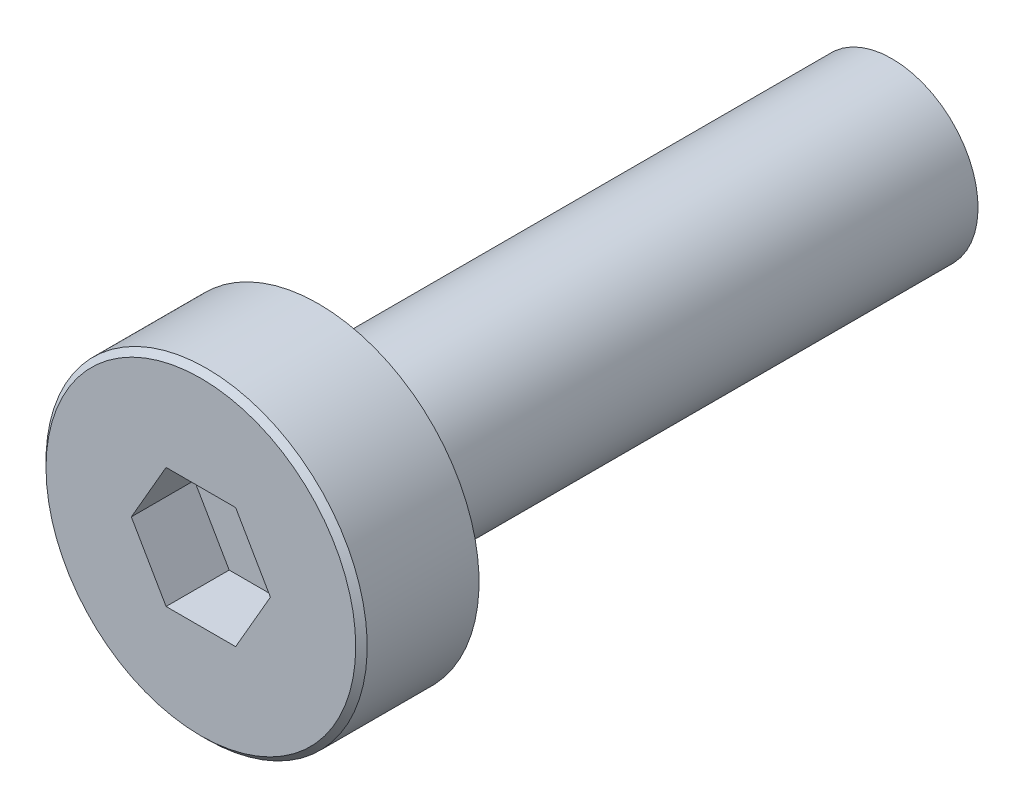
ISO-10303-21;
HEADER;
FILE_DESCRIPTION(('STEP AP214'),'2;1');
FILE_NAME('part.step','',(''),(''),'','','');
FILE_SCHEMA(('AUTOMOTIVE_DESIGN { 1 0 10303 214 1 1 1 1 }'));
ENDSEC;
DATA;
#1=APPLICATION_CONTEXT('core data for automotive mechanical design processes');
#2=APPLICATION_PROTOCOL_DEFINITION('international standard','automotive_design',2000,#1);
#3=PRODUCT_CONTEXT('',#1,'mechanical');
#4=PRODUCT('Part','Part','',(#3));
#5=PRODUCT_RELATED_PRODUCT_CATEGORY('part','',(#4));
#6=PRODUCT_DEFINITION_FORMATION('','',#4);
#7=PRODUCT_DEFINITION_CONTEXT('part definition',#1,'design');
#8=PRODUCT_DEFINITION('design','',#6,#7);
#9=PRODUCT_DEFINITION_SHAPE('','',#8);
#10=(LENGTH_UNIT() NAMED_UNIT(*) SI_UNIT(.MILLI.,.METRE.));
#11=(NAMED_UNIT(*) PLANE_ANGLE_UNIT() SI_UNIT($,.RADIAN.));
#12=(NAMED_UNIT(*) SI_UNIT($,.STERADIAN.) SOLID_ANGLE_UNIT());
#13=UNCERTAINTY_MEASURE_WITH_UNIT(LENGTH_MEASURE(1.E-05),#10,'distance_accuracy_value','');
#14=(GEOMETRIC_REPRESENTATION_CONTEXT(3) GLOBAL_UNCERTAINTY_ASSIGNED_CONTEXT((#13)) GLOBAL_UNIT_ASSIGNED_CONTEXT((#10,
#11,#12)) REPRESENTATION_CONTEXT('',''));
#15=CARTESIAN_POINT('',(0.,0.,0.));
#16=DIRECTION('',(0.,0.,1.));
#17=DIRECTION('',(1.,0.,0.));
#18=AXIS2_PLACEMENT_3D('',#15,#16,#17);
#19=CARTESIAN_POINT('',(0.,0.,0.));
#20=DIRECTION('',(0.,0.,1.));
#21=DIRECTION('',(0.,-1.,0.));
#22=AXIS2_PLACEMENT_3D('',#19,#20,#21);
#23=PLANE('',#22);
#24=CARTESIAN_POINT('',(0.,0.,0.));
#25=DIRECTION('',(0.,0.,1.));
#26=DIRECTION('',(0.,-1.,0.));
#27=AXIS2_PLACEMENT_3D('',#24,#25,#26);
#28=CIRCLE('',#27,2.7);
#29=CARTESIAN_POINT('',(0.,-2.7,0.));
#30=VERTEX_POINT('',#29);
#31=EDGE_CURVE('E11',#30,#30,#28,.T.);
#32=ORIENTED_EDGE('',*,*,#31,.T.);
#33=EDGE_LOOP('',(#32));
#34=FACE_BOUND('',#33,.T.);
#35=DIRECTION('',(-0.5,0.866025403784439,0.));
#36=VECTOR('',#35,1.);
#37=CARTESIAN_POINT('',(1.21243556529821,0.,0.));
#38=LINE('',#37,#36);
#39=CARTESIAN_POINT('',(1.21243556529821,0.,0.));
#40=VERTEX_POINT('',#39);
#41=CARTESIAN_POINT('',(0.606217782649107,1.05,0.));
#42=VERTEX_POINT('',#41);
#43=EDGE_CURVE('E56',#40,#42,#38,.T.);
#44=ORIENTED_EDGE('',*,*,#43,.F.);
#45=DIRECTION('',(0.5,0.866025403784439,0.));
#46=VECTOR('',#45,1.);
#47=CARTESIAN_POINT('',(0.606217782649107,-1.05,0.));
#48=LINE('',#47,#46);
#49=CARTESIAN_POINT('',(0.606217782649107,-1.05,0.));
#50=VERTEX_POINT('',#49);
#51=EDGE_CURVE('E139',#50,#40,#48,.T.);
#52=ORIENTED_EDGE('',*,*,#51,.F.);
#53=DIRECTION('',(1.,0.,0.));
#54=VECTOR('',#53,1.);
#55=CARTESIAN_POINT('',(-0.606217782649107,-1.05,0.));
#56=LINE('',#55,#54);
#57=CARTESIAN_POINT('',(-0.606217782649107,-1.05,0.));
#58=VERTEX_POINT('',#57);
#59=EDGE_CURVE('E137',#58,#50,#56,.T.);
#60=ORIENTED_EDGE('',*,*,#59,.F.);
#61=DIRECTION('',(0.5,-0.866025403784438,0.));
#62=VECTOR('',#61,1.);
#63=CARTESIAN_POINT('',(-1.21243556529821,0.,0.));
#64=LINE('',#63,#62);
#65=CARTESIAN_POINT('',(-1.21243556529821,0.,0.));
#66=VERTEX_POINT('',#65);
#67=EDGE_CURVE('E104',#66,#58,#64,.T.);
#68=ORIENTED_EDGE('',*,*,#67,.F.);
#69=DIRECTION('',(-0.5,-0.866025403784439,0.));
#70=VECTOR('',#69,1.);
#71=CARTESIAN_POINT('',(-0.606217782649107,1.05,0.));
#72=LINE('',#71,#70);
#73=CARTESIAN_POINT('',(-0.606217782649107,1.05,0.));
#74=VERTEX_POINT('',#73);
#75=EDGE_CURVE('E133',#74,#66,#72,.T.);
#76=ORIENTED_EDGE('',*,*,#75,.F.);
#77=DIRECTION('',(-1.,0.,0.));
#78=VECTOR('',#77,1.);
#79=CARTESIAN_POINT('',(0.606217782649107,1.05,0.));
#80=LINE('',#79,#78);
#81=EDGE_CURVE('E130',#42,#74,#80,.T.);
#82=ORIENTED_EDGE('',*,*,#81,.F.);
#83=EDGE_LOOP('',(#44,#52,#60,#68,#76,#82));
#84=FACE_BOUND('',#83,.T.);
#85=ADVANCED_FACE('F40',(#34,#84),#23,.T.);
#86=CARTESIAN_POINT('',(0.,0.,-12.05));
#87=DIRECTION('',(0.,0.,-1.));
#88=DIRECTION('',(0.,1.,0.));
#89=AXIS2_PLACEMENT_3D('',#86,#87,#88);
#90=CYLINDRICAL_SURFACE('',#89,2.8);
#91=CARTESIAN_POINT('',(0.,0.,-0.100000000000005));
#92=DIRECTION('',(0.,0.,1.));
#93=DIRECTION('',(0.,-1.,0.));
#94=AXIS2_PLACEMENT_3D('',#91,#92,#93);
#95=CIRCLE('',#94,2.8);
#96=CARTESIAN_POINT('',(0.,-2.8,-0.100000000000005));
#97=VERTEX_POINT('',#96);
#98=EDGE_CURVE('E49',#97,#97,#95,.F.);
#99=ORIENTED_EDGE('',*,*,#98,.T.);
#100=EDGE_LOOP('',(#99));
#101=FACE_BOUND('',#100,.T.);
#102=CARTESIAN_POINT('',(0.,0.,-2.05));
#103=DIRECTION('',(0.,0.,-1.));
#104=DIRECTION('',(0.,1.,0.));
#105=AXIS2_PLACEMENT_3D('',#102,#103,#104);
#106=CIRCLE('',#105,2.8);
#107=CARTESIAN_POINT('',(0.,2.8,-2.05));
#108=VERTEX_POINT('',#107);
#109=EDGE_CURVE('E154',#108,#108,#106,.T.);
#110=ORIENTED_EDGE('',*,*,#109,.F.);
#111=EDGE_LOOP('',(#110));
#112=FACE_BOUND('',#111,.T.);
#113=ADVANCED_FACE('F159',(#101,#112),#90,.T.);
#114=CARTESIAN_POINT('',(0.,2.8,-2.05));
#115=DIRECTION('',(0.,0.,-1.));
#116=DIRECTION('',(0.,1.,0.));
#117=AXIS2_PLACEMENT_3D('',#114,#115,#116);
#118=PLANE('',#117);
#119=ORIENTED_EDGE('',*,*,#109,.T.);
#120=EDGE_LOOP('',(#119));
#121=FACE_BOUND('',#120,.T.);
#122=CARTESIAN_POINT('',(0.,0.,-2.05));
#123=DIRECTION('',(0.,0.,-1.));
#124=DIRECTION('',(0.,1.,0.));
#125=AXIS2_PLACEMENT_3D('',#122,#123,#124);
#126=CIRCLE('',#125,1.5);
#127=CARTESIAN_POINT('',(0.,1.5,-2.05));
#128=VERTEX_POINT('',#127);
#129=EDGE_CURVE('E151',#128,#128,#126,.T.);
#130=ORIENTED_EDGE('',*,*,#129,.F.);
#131=EDGE_LOOP('',(#130));
#132=FACE_BOUND('',#131,.T.);
#133=ADVANCED_FACE('F175',(#121,#132),#118,.T.);
#134=CARTESIAN_POINT('',(0.,0.,-12.05));
#135=DIRECTION('',(0.,0.,-1.));
#136=DIRECTION('',(0.,1.,0.));
#137=AXIS2_PLACEMENT_3D('',#134,#135,#136);
#138=CYLINDRICAL_SURFACE('',#137,1.5);
#139=ORIENTED_EDGE('',*,*,#129,.T.);
#140=EDGE_LOOP('',(#139));
#141=FACE_BOUND('',#140,.T.);
#142=CARTESIAN_POINT('',(0.,0.,-12.05));
#143=DIRECTION('',(0.,0.,-1.));
#144=DIRECTION('',(0.,1.,0.));
#145=AXIS2_PLACEMENT_3D('',#142,#143,#144);
#146=CIRCLE('',#145,1.5);
#147=CARTESIAN_POINT('',(0.,1.5,-12.05));
#148=VERTEX_POINT('',#147);
#149=EDGE_CURVE('E143',#148,#148,#146,.T.);
#150=ORIENTED_EDGE('',*,*,#149,.F.);
#151=EDGE_LOOP('',(#150));
#152=FACE_BOUND('',#151,.T.);
#153=ADVANCED_FACE('F181',(#141,#152),#138,.T.);
#154=CARTESIAN_POINT('',(0.,1.5,-12.05));
#155=DIRECTION('',(0.,0.,-1.));
#156=DIRECTION('',(0.,1.,0.));
#157=AXIS2_PLACEMENT_3D('',#154,#155,#156);
#158=PLANE('',#157);
#159=ORIENTED_EDGE('',*,*,#149,.T.);
#160=EDGE_LOOP('',(#159));
#161=FACE_BOUND('',#160,.T.);
#162=ADVANCED_FACE('F185',(#161),#158,.T.);
#163=CARTESIAN_POINT('',(1.21243556529821,0.,-1.1));
#164=DIRECTION('',(0.866025403784438,0.5,0.));
#165=DIRECTION('',(-0.5,0.866025403784438,0.));
#166=AXIS2_PLACEMENT_3D('',#163,#164,#165);
#167=PLANE('',#166);
#168=ORIENTED_EDGE('',*,*,#43,.T.);
#169=DIRECTION('',(0.,0.,1.));
#170=VECTOR('',#169,1.);
#171=CARTESIAN_POINT('',(0.606217782649107,1.05,-1.1));
#172=LINE('',#171,#170);
#173=CARTESIAN_POINT('',(0.606217782649107,1.05,-1.1));
#174=VERTEX_POINT('',#173);
#175=EDGE_CURVE('E86',#174,#42,#172,.T.);
#176=ORIENTED_EDGE('',*,*,#175,.F.);
#177=DIRECTION('',(-0.5,0.866025403784439,0.));
#178=VECTOR('',#177,1.);
#179=CARTESIAN_POINT('',(1.21243556529821,0.,-1.1));
#180=LINE('',#179,#178);
#181=CARTESIAN_POINT('',(1.21243556529821,0.,-1.1));
#182=VERTEX_POINT('',#181);
#183=EDGE_CURVE('E141',#182,#174,#180,.T.);
#184=ORIENTED_EDGE('',*,*,#183,.F.);
#185=DIRECTION('',(0.,0.,1.));
#186=VECTOR('',#185,1.);
#187=CARTESIAN_POINT('',(1.21243556529821,0.,-1.1));
#188=LINE('',#187,#186);
#189=EDGE_CURVE('E64',#182,#40,#188,.T.);
#190=ORIENTED_EDGE('',*,*,#189,.T.);
#191=EDGE_LOOP('',(#168,#176,#184,#190));
#192=FACE_BOUND('',#191,.T.);
#193=ADVANCED_FACE('F189',(#192),#167,.F.);
#194=CARTESIAN_POINT('',(0.606217782649107,-1.05,-1.1));
#195=DIRECTION('',(0.866025403784438,-0.5,0.));
#196=DIRECTION('',(0.5,0.866025403784439,0.));
#197=AXIS2_PLACEMENT_3D('',#194,#195,#196);
#198=PLANE('',#197);
#199=ORIENTED_EDGE('',*,*,#51,.T.);
#200=ORIENTED_EDGE('',*,*,#189,.F.);
#201=DIRECTION('',(0.5,0.866025403784439,0.));
#202=VECTOR('',#201,1.);
#203=CARTESIAN_POINT('',(0.606217782649107,-1.05,-1.1));
#204=LINE('',#203,#202);
#205=CARTESIAN_POINT('',(0.606217782649107,-1.05,-1.1));
#206=VERTEX_POINT('',#205);
#207=EDGE_CURVE('E116',#206,#182,#204,.T.);
#208=ORIENTED_EDGE('',*,*,#207,.F.);
#209=DIRECTION('',(0.,0.,1.));
#210=VECTOR('',#209,1.);
#211=CARTESIAN_POINT('',(0.606217782649107,-1.05,-1.1));
#212=LINE('',#211,#210);
#213=EDGE_CURVE('E108',#206,#50,#212,.T.);
#214=ORIENTED_EDGE('',*,*,#213,.T.);
#215=EDGE_LOOP('',(#199,#200,#208,#214));
#216=FACE_BOUND('',#215,.T.);
#217=ADVANCED_FACE('F193',(#216),#198,.F.);
#218=CARTESIAN_POINT('',(-0.606217782649107,-1.05,-1.1));
#219=DIRECTION('',(0.,-1.,0.));
#220=DIRECTION('',(0.,0.,-1.));
#221=AXIS2_PLACEMENT_3D('',#218,#219,#220);
#222=PLANE('',#221);
#223=ORIENTED_EDGE('',*,*,#59,.T.);
#224=ORIENTED_EDGE('',*,*,#213,.F.);
#225=DIRECTION('',(1.,0.,0.));
#226=VECTOR('',#225,1.);
#227=CARTESIAN_POINT('',(-0.606217782649107,-1.05,-1.1));
#228=LINE('',#227,#226);
#229=CARTESIAN_POINT('',(-0.606217782649107,-1.05,-1.1));
#230=VERTEX_POINT('',#229);
#231=EDGE_CURVE('E112',#230,#206,#228,.T.);
#232=ORIENTED_EDGE('',*,*,#231,.F.);
#233=DIRECTION('',(0.,0.,1.));
#234=VECTOR('',#233,1.);
#235=CARTESIAN_POINT('',(-0.606217782649107,-1.05,-1.1));
#236=LINE('',#235,#234);
#237=EDGE_CURVE('E97',#230,#58,#236,.T.);
#238=ORIENTED_EDGE('',*,*,#237,.T.);
#239=EDGE_LOOP('',(#223,#224,#232,#238));
#240=FACE_BOUND('',#239,.T.);
#241=ADVANCED_FACE('F113',(#240),#222,.F.);
#242=CARTESIAN_POINT('',(-1.21243556529821,0.,-1.1));
#243=DIRECTION('',(-0.866025403784439,-0.5,0.));
#244=DIRECTION('',(0.5,-0.866025403784439,0.));
#245=AXIS2_PLACEMENT_3D('',#242,#243,#244);
#246=PLANE('',#245);
#247=ORIENTED_EDGE('',*,*,#67,.T.);
#248=ORIENTED_EDGE('',*,*,#237,.F.);
#249=DIRECTION('',(0.5,-0.866025403784438,0.));
#250=VECTOR('',#249,1.);
#251=CARTESIAN_POINT('',(-1.21243556529821,0.,-1.1));
#252=LINE('',#251,#250);
#253=CARTESIAN_POINT('',(-1.21243556529821,0.,-1.1));
#254=VERTEX_POINT('',#253);
#255=EDGE_CURVE('E101',#254,#230,#252,.T.);
#256=ORIENTED_EDGE('',*,*,#255,.F.);
#257=DIRECTION('',(0.,0.,1.));
#258=VECTOR('',#257,1.);
#259=CARTESIAN_POINT('',(-1.21243556529821,0.,-1.1));
#260=LINE('',#259,#258);
#261=EDGE_CURVE('E109',#254,#66,#260,.T.);
#262=ORIENTED_EDGE('',*,*,#261,.T.);
#263=EDGE_LOOP('',(#247,#248,#256,#262));
#264=FACE_BOUND('',#263,.T.);
#265=ADVANCED_FACE('F99',(#264),#246,.F.);
#266=CARTESIAN_POINT('',(-0.606217782649107,1.05,-1.1));
#267=DIRECTION('',(-0.866025403784439,0.5,0.));
#268=DIRECTION('',(-0.5,-0.866025403784439,0.));
#269=AXIS2_PLACEMENT_3D('',#266,#267,#268);
#270=PLANE('',#269);
#271=ORIENTED_EDGE('',*,*,#75,.T.);
#272=ORIENTED_EDGE('',*,*,#261,.F.);
#273=DIRECTION('',(-0.5,-0.866025403784439,0.));
#274=VECTOR('',#273,1.);
#275=CARTESIAN_POINT('',(-0.606217782649107,1.05,-1.1));
#276=LINE('',#275,#274);
#277=CARTESIAN_POINT('',(-0.606217782649107,1.05,-1.1));
#278=VERTEX_POINT('',#277);
#279=EDGE_CURVE('E122',#278,#254,#276,.T.);
#280=ORIENTED_EDGE('',*,*,#279,.F.);
#281=DIRECTION('',(0.,0.,1.));
#282=VECTOR('',#281,1.);
#283=CARTESIAN_POINT('',(-0.606217782649107,1.05,-1.1));
#284=LINE('',#283,#282);
#285=EDGE_CURVE('E146',#278,#74,#284,.T.);
#286=ORIENTED_EDGE('',*,*,#285,.T.);
#287=EDGE_LOOP('',(#271,#272,#280,#286));
#288=FACE_BOUND('',#287,.T.);
#289=ADVANCED_FACE('F196',(#288),#270,.F.);
#290=CARTESIAN_POINT('',(0.606217782649107,1.05,-1.1));
#291=DIRECTION('',(0.,1.,0.));
#292=DIRECTION('',(-1.,0.,0.));
#293=AXIS2_PLACEMENT_3D('',#290,#291,#292);
#294=PLANE('',#293);
#295=ORIENTED_EDGE('',*,*,#81,.T.);
#296=ORIENTED_EDGE('',*,*,#285,.F.);
#297=DIRECTION('',(-1.,0.,0.));
#298=VECTOR('',#297,1.);
#299=CARTESIAN_POINT('',(0.606217782649107,1.05,-1.1));
#300=LINE('',#299,#298);
#301=EDGE_CURVE('E124',#174,#278,#300,.T.);
#302=ORIENTED_EDGE('',*,*,#301,.F.);
#303=ORIENTED_EDGE('',*,*,#175,.T.);
#304=EDGE_LOOP('',(#295,#296,#302,#303));
#305=FACE_BOUND('',#304,.T.);
#306=ADVANCED_FACE('F167',(#305),#294,.F.);
#307=CARTESIAN_POINT('',(0.,0.,-1.1));
#308=DIRECTION('',(0.,0.,1.));
#309=DIRECTION('',(1.,0.,0.));
#310=AXIS2_PLACEMENT_3D('',#307,#308,#309);
#311=PLANE('',#310);
#312=ORIENTED_EDGE('',*,*,#183,.T.);
#313=ORIENTED_EDGE('',*,*,#301,.T.);
#314=ORIENTED_EDGE('',*,*,#279,.T.);
#315=ORIENTED_EDGE('',*,*,#255,.T.);
#316=ORIENTED_EDGE('',*,*,#231,.T.);
#317=ORIENTED_EDGE('',*,*,#207,.T.);
#318=EDGE_LOOP('',(#312,#313,#314,#315,#316,#317));
#319=FACE_BOUND('',#318,.T.);
#320=ADVANCED_FACE('F119',(#319),#311,.T.);
#321=CARTESIAN_POINT('',(0.,0.,-0.100000000000005));
#322=DIRECTION('',(0.,0.,-1.));
#323=DIRECTION('',(0.,1.,0.));
#324=AXIS2_PLACEMENT_3D('',#321,#322,#323);
#325=CONICAL_SURFACE('',#324,2.8,0.785398163397446);
#326=ORIENTED_EDGE('',*,*,#31,.F.);
#327=EDGE_LOOP('',(#326));
#328=FACE_BOUND('',#327,.T.);
#329=ORIENTED_EDGE('',*,*,#98,.F.);
#330=EDGE_LOOP('',(#329));
#331=FACE_BOUND('',#330,.T.);
#332=ADVANCED_FACE('F43',(#328,#331),#325,.T.);
#333=CLOSED_SHELL('',(#85,#113,#133,#153,#162,#193,#217,#241,#265,#289,#306,#320,#332));
#334=MANIFOLD_SOLID_BREP('B2',#333);
#335=ADVANCED_BREP_SHAPE_REPRESENTATION('',(#18,#334),#14);
#336=SHAPE_DEFINITION_REPRESENTATION(#9,#335);
ENDSEC;
END-ISO-10303-21;
